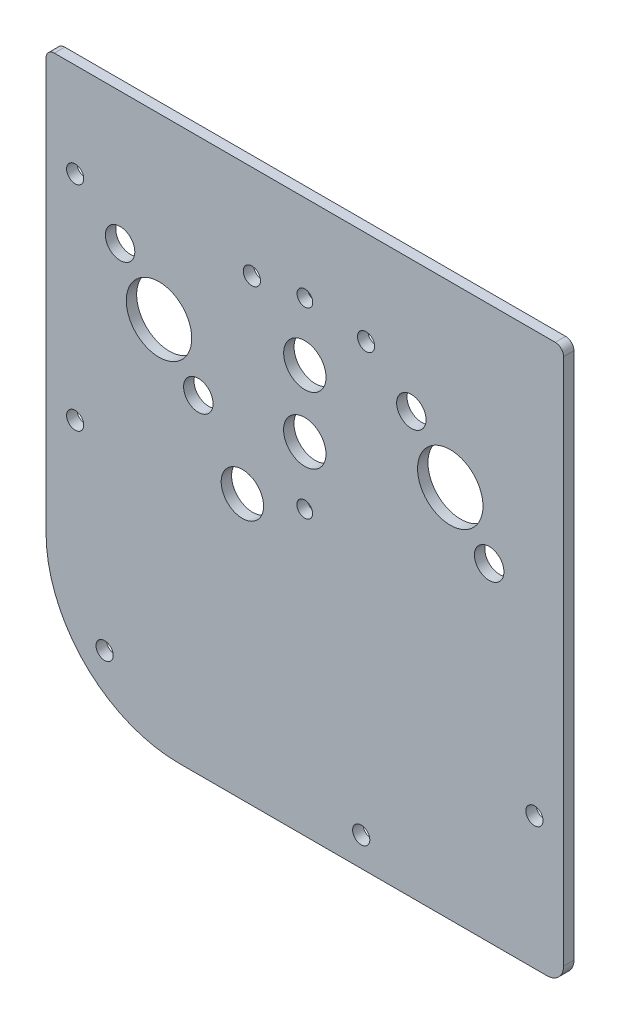
ISO-10303-21;
HEADER;
FILE_DESCRIPTION(('STEP AP214'),'2;1');
FILE_NAME('part.step','',(''),(''),'','','');
FILE_SCHEMA(('AUTOMOTIVE_DESIGN { 1 0 10303 214 1 1 1 1 }'));
ENDSEC;
DATA;
#1=APPLICATION_CONTEXT('core data for automotive mechanical design processes');
#2=APPLICATION_PROTOCOL_DEFINITION('international standard','automotive_design',2000,#1);
#3=PRODUCT_CONTEXT('',#1,'mechanical');
#4=PRODUCT('Part','Part','',(#3));
#5=PRODUCT_RELATED_PRODUCT_CATEGORY('part','',(#4));
#6=PRODUCT_DEFINITION_FORMATION('','',#4);
#7=PRODUCT_DEFINITION_CONTEXT('part definition',#1,'design');
#8=PRODUCT_DEFINITION('design','',#6,#7);
#9=PRODUCT_DEFINITION_SHAPE('','',#8);
#10=(LENGTH_UNIT() NAMED_UNIT(*) SI_UNIT(.MILLI.,.METRE.));
#11=(NAMED_UNIT(*) PLANE_ANGLE_UNIT() SI_UNIT($,.RADIAN.));
#12=(NAMED_UNIT(*) SI_UNIT($,.STERADIAN.) SOLID_ANGLE_UNIT());
#13=UNCERTAINTY_MEASURE_WITH_UNIT(LENGTH_MEASURE(1.E-05),#10,'distance_accuracy_value','');
#14=(GEOMETRIC_REPRESENTATION_CONTEXT(3) GLOBAL_UNCERTAINTY_ASSIGNED_CONTEXT((#13)) GLOBAL_UNIT_ASSIGNED_CONTEXT((#10,
#11,#12)) REPRESENTATION_CONTEXT('',''));
#15=CARTESIAN_POINT('',(0.,0.,0.));
#16=DIRECTION('',(0.,0.,1.));
#17=DIRECTION('',(1.,0.,0.));
#18=AXIS2_PLACEMENT_3D('',#15,#16,#17);
#19=CARTESIAN_POINT('',(17.6273398829879,16.1523200630568,3.175));
#20=DIRECTION('',(0.,0.,-1.));
#21=DIRECTION('',(-1.,0.,0.));
#22=AXIS2_PLACEMENT_3D('',#19,#20,#21);
#23=PLANE('',#22);
#24=DIRECTION('',(-1.,0.,0.));
#25=VECTOR('',#24,1.);
#26=CARTESIAN_POINT('',(-23.0126601170121,144.422318994933,3.175));
#27=LINE('',#26,#25);
#28=CARTESIAN_POINT('',(132.590651825324,144.422318994933,3.175));
#29=VERTEX_POINT('',#28);
#30=CARTESIAN_POINT('',(-20.4726601170121,144.422318994933,3.175));
#31=VERTEX_POINT('',#30);
#32=EDGE_CURVE('E154',#29,#31,#27,.T.);
#33=ORIENTED_EDGE('',*,*,#32,.T.);
#34=CARTESIAN_POINT('',(-20.4726601170121,141.882318994933,3.175));
#35=DIRECTION('',(0.,0.,-1.));
#36=DIRECTION('',(-1.,0.,0.));
#37=AXIS2_PLACEMENT_3D('',#34,#35,#36);
#38=CIRCLE('',#37,2.54);
#39=CARTESIAN_POINT('',(-23.0126601170121,141.882318994933,3.175));
#40=VERTEX_POINT('',#39);
#41=EDGE_CURVE('E139',#31,#40,#38,.F.);
#42=ORIENTED_EDGE('',*,*,#41,.T.);
#43=DIRECTION('',(0.,-1.,0.));
#44=VECTOR('',#43,1.);
#45=CARTESIAN_POINT('',(-23.0126601170121,16.1523200630571,3.175));
#46=LINE('',#45,#44);
#47=CARTESIAN_POINT('',(-23.0126601170121,16.1523200630571,3.175));
#48=VERTEX_POINT('',#47);
#49=EDGE_CURVE('E118',#40,#48,#46,.T.);
#50=ORIENTED_EDGE('',*,*,#49,.T.);
#51=CARTESIAN_POINT('',(17.6273398829879,16.1523200630568,3.175));
#52=DIRECTION('',(0.,0.,1.));
#53=DIRECTION('',(-1.,0.,0.));
#54=AXIS2_PLACEMENT_3D('',#51,#52,#53);
#55=CIRCLE('',#54,40.64);
#56=CARTESIAN_POINT('',(17.6273398829882,-24.4876799369432,3.175));
#57=VERTEX_POINT('',#56);
#58=EDGE_CURVE('E113',#48,#57,#55,.T.);
#59=ORIENTED_EDGE('',*,*,#58,.T.);
#60=DIRECTION('',(1.,0.,0.));
#61=VECTOR('',#60,1.);
#62=CARTESIAN_POINT('',(130.050651825323,-24.4876799369432,3.175));
#63=LINE('',#62,#61);
#64=CARTESIAN_POINT('',(130.050651825323,-24.4876799369432,3.175));
#65=VERTEX_POINT('',#64);
#66=EDGE_CURVE('E102',#57,#65,#63,.T.);
#67=ORIENTED_EDGE('',*,*,#66,.T.);
#68=CARTESIAN_POINT('',(130.050651825323,-19.4076799369432,3.175));
#69=DIRECTION('',(0.,0.,1.));
#70=DIRECTION('',(-1.,0.,0.));
#71=AXIS2_PLACEMENT_3D('',#68,#69,#70);
#72=CIRCLE('',#71,5.08);
#73=CARTESIAN_POINT('',(135.130651825323,-19.4076799369432,3.175));
#74=VERTEX_POINT('',#73);
#75=EDGE_CURVE('E112',#65,#74,#72,.T.);
#76=ORIENTED_EDGE('',*,*,#75,.T.);
#77=DIRECTION('',(0.,1.,0.));
#78=VECTOR('',#77,1.);
#79=CARTESIAN_POINT('',(135.130651825323,119.022318994933,3.175));
#80=LINE('',#79,#78);
#81=CARTESIAN_POINT('',(135.130651825323,141.882318994933,3.175));
#82=VERTEX_POINT('',#81);
#83=EDGE_CURVE('E159',#74,#82,#80,.T.);
#84=ORIENTED_EDGE('',*,*,#83,.T.);
#85=CARTESIAN_POINT('',(132.590651825324,141.882318994933,3.175));
#86=DIRECTION('',(0.,0.,-1.));
#87=DIRECTION('',(-1.,0.,0.));
#88=AXIS2_PLACEMENT_3D('',#85,#86,#87);
#89=CIRCLE('',#88,2.54);
#90=EDGE_CURVE('E137',#82,#29,#89,.F.);
#91=ORIENTED_EDGE('',*,*,#90,.T.);
#92=EDGE_LOOP('',(#33,#42,#50,#59,#67,#76,#84,#91));
#93=FACE_BOUND('',#92,.T.);
#94=CARTESIAN_POINT('',(-14.1226601170121,115.657274827858,3.175));
#95=DIRECTION('',(0.,0.,1.));
#96=DIRECTION('',(1.,0.,0.));
#97=AXIS2_PLACEMENT_3D('',#94,#95,#96);
#98=CIRCLE('',#97,2.625);
#99=CARTESIAN_POINT('',(-11.4976601170121,115.657274827858,3.175));
#100=VERTEX_POINT('',#99);
#101=EDGE_CURVE('E168',#100,#100,#98,.T.);
#102=ORIENTED_EDGE('',*,*,#101,.F.);
#103=EDGE_LOOP('',(#102));
#104=FACE_BOUND('',#103,.T.);
#105=CARTESIAN_POINT('',(56.0501289610006,79.7923335043713,3.175));
#106=DIRECTION('',(0.,0.,1.));
#107=DIRECTION('',(1.,0.,0.));
#108=AXIS2_PLACEMENT_3D('',#105,#106,#107);
#109=CIRCLE('',#108,6.47699999999994);
#110=CARTESIAN_POINT('',(62.5271289610006,79.7923335043713,3.175));
#111=VERTEX_POINT('',#110);
#112=EDGE_CURVE('E187',#111,#111,#109,.T.);
#113=ORIENTED_EDGE('',*,*,#112,.F.);
#114=EDGE_LOOP('',(#113));
#115=FACE_BOUND('',#114,.T.);
#116=CARTESIAN_POINT('',(56.0346118979793,62.0123402754425,3.175));
#117=DIRECTION('',(0.,0.,1.));
#118=DIRECTION('',(1.,0.,0.));
#119=AXIS2_PLACEMENT_3D('',#116,#117,#118);
#120=CIRCLE('',#119,2.40000000000007);
#121=CARTESIAN_POINT('',(58.4346118979794,62.0123402754425,3.175));
#122=VERTEX_POINT('',#121);
#123=EDGE_CURVE('E193',#122,#122,#120,.T.);
#124=ORIENTED_EDGE('',*,*,#123,.F.);
#125=EDGE_LOOP('',(#124));
#126=FACE_BOUND('',#125,.T.);
#127=CARTESIAN_POINT('',(56.0678627473108,100.112325766004,3.175));
#128=DIRECTION('',(0.,0.,1.));
#129=DIRECTION('',(1.,0.,0.));
#130=AXIS2_PLACEMENT_3D('',#127,#128,#129);
#131=CIRCLE('',#130,6.47699999999991);
#132=CARTESIAN_POINT('',(62.5448627473107,100.112325766004,3.175));
#133=VERTEX_POINT('',#132);
#134=EDGE_CURVE('E199',#133,#133,#131,.T.);
#135=ORIENTED_EDGE('',*,*,#134,.F.);
#136=EDGE_LOOP('',(#135));
#137=FACE_BOUND('',#136,.T.);
#138=CARTESIAN_POINT('',(56.0833798103321,117.892318994933,3.175));
#139=DIRECTION('',(0.,0.,1.));
#140=DIRECTION('',(1.,0.,0.));
#141=AXIS2_PLACEMENT_3D('',#138,#139,#140);
#142=CIRCLE('',#141,2.40000000000009);
#143=CARTESIAN_POINT('',(58.4833798103322,117.892318994933,3.175));
#144=VERTEX_POINT('',#143);
#145=EDGE_CURVE('E205',#144,#144,#142,.T.);
#146=ORIENTED_EDGE('',*,*,#145,.F.);
#147=EDGE_LOOP('',(#146));
#148=FACE_BOUND('',#147,.T.);
#149=CARTESIAN_POINT('',(36.9797887004855,56.4940646999634,3.175));
#150=DIRECTION('',(0.,0.,1.));
#151=DIRECTION('',(1.,0.,0.));
#152=AXIS2_PLACEMENT_3D('',#149,#150,#151);
#153=CIRCLE('',#152,6.47699999999992);
#154=CARTESIAN_POINT('',(43.4567887004854,56.4940646999634,3.175));
#155=VERTEX_POINT('',#154);
#156=EDGE_CURVE('E211',#155,#155,#153,.T.);
#157=ORIENTED_EDGE('',*,*,#156,.F.);
#158=EDGE_LOOP('',(#157));
#159=FACE_BOUND('',#158,.T.);
#160=CARTESIAN_POINT('',(39.8805714177449,115.657274827858,3.175));
#161=DIRECTION('',(0.,0.,1.));
#162=DIRECTION('',(1.,0.,0.));
#163=AXIS2_PLACEMENT_3D('',#160,#161,#162);
#164=CIRCLE('',#163,2.625);
#165=CARTESIAN_POINT('',(42.5055714177449,115.657274827858,3.175));
#166=VERTEX_POINT('',#165);
#167=EDGE_CURVE('E217',#166,#166,#164,.T.);
#168=ORIENTED_EDGE('',*,*,#167,.F.);
#169=EDGE_LOOP('',(#168));
#170=FACE_BOUND('',#169,.T.);
#171=CARTESIAN_POINT('',(74.7774202905663,115.710615977275,3.175));
#172=DIRECTION('',(0.,0.,1.));
#173=DIRECTION('',(1.,0.,0.));
#174=AXIS2_PLACEMENT_3D('',#171,#172,#173);
#175=CIRCLE('',#174,2.625);
#176=CARTESIAN_POINT('',(77.4024202905663,115.710615977275,3.175));
#177=VERTEX_POINT('',#176);
#178=EDGE_CURVE('E223',#177,#177,#175,.T.);
#179=ORIENTED_EDGE('',*,*,#178,.F.);
#180=EDGE_LOOP('',(#179));
#181=FACE_BOUND('',#180,.T.);
#182=CARTESIAN_POINT('',(-14.1226601170121,50.442319528995,3.175));
#183=DIRECTION('',(0.,0.,1.));
#184=DIRECTION('',(1.,0.,0.));
#185=AXIS2_PLACEMENT_3D('',#182,#183,#184);
#186=CIRCLE('',#185,2.625);
#187=CARTESIAN_POINT('',(-11.4976601170121,50.442319528995,3.175));
#188=VERTEX_POINT('',#187);
#189=EDGE_CURVE('E229',#188,#188,#186,.T.);
#190=ORIENTED_EDGE('',*,*,#189,.F.);
#191=EDGE_LOOP('',(#190));
#192=FACE_BOUND('',#191,.T.);
#193=CARTESIAN_POINT('',(88.617464571678,104.150823250246,3.175));
#194=DIRECTION('',(0.,0.,1.));
#195=DIRECTION('',(1.,0.,0.));
#196=AXIS2_PLACEMENT_3D('',#193,#194,#195);
#197=CIRCLE('',#196,4.50000370000001);
#198=CARTESIAN_POINT('',(93.117468271678,104.150823250246,3.175));
#199=VERTEX_POINT('',#198);
#200=EDGE_CURVE('E235',#199,#199,#197,.T.);
#201=ORIENTED_EDGE('',*,*,#200,.F.);
#202=EDGE_LOOP('',(#201));
#203=FACE_BOUND('',#202,.T.);
#204=CARTESIAN_POINT('',(-5.12428887698043,-6.01627799885446,3.175));
#205=DIRECTION('',(0.,0.,1.));
#206=DIRECTION('',(1.,0.,0.));
#207=AXIS2_PLACEMENT_3D('',#204,#205,#206);
#208=CIRCLE('',#207,2.625);
#209=CARTESIAN_POINT('',(-2.49928887698043,-6.01627799885446,3.175));
#210=VERTEX_POINT('',#209);
#211=EDGE_CURVE('E241',#210,#210,#208,.T.);
#212=ORIENTED_EDGE('',*,*,#211,.F.);
#213=EDGE_LOOP('',(#212));
#214=FACE_BOUND('',#213,.T.);
#215=CARTESIAN_POINT('',(112.400607544212,75.807177169546,3.175));
#216=DIRECTION('',(0.,0.,1.));
#217=DIRECTION('',(1.,0.,0.));
#218=AXIS2_PLACEMENT_3D('',#215,#216,#217);
#219=CIRCLE('',#218,4.50000370000001);
#220=CARTESIAN_POINT('',(116.900611244212,75.807177169546,3.175));
#221=VERTEX_POINT('',#220);
#222=EDGE_CURVE('E247',#221,#221,#219,.T.);
#223=ORIENTED_EDGE('',*,*,#222,.F.);
#224=EDGE_LOOP('',(#223));
#225=FACE_BOUND('',#224,.T.);
#226=CARTESIAN_POINT('',(73.2964118888717,-15.5976799369432,3.175));
#227=DIRECTION('',(0.,0.,1.));
#228=DIRECTION('',(1.,0.,0.));
#229=AXIS2_PLACEMENT_3D('',#226,#227,#228);
#230=CIRCLE('',#229,2.625);
#231=CARTESIAN_POINT('',(75.9214118888717,-15.5976799369432,3.175));
#232=VERTEX_POINT('',#231);
#233=EDGE_CURVE('E253',#232,#232,#230,.T.);
#234=ORIENTED_EDGE('',*,*,#233,.F.);
#235=EDGE_LOOP('',(#234));
#236=FACE_BOUND('',#235,.T.);
#237=CARTESIAN_POINT('',(126.240651825324,15.9467567381489,3.175));
#238=DIRECTION('',(0.,0.,1.));
#239=DIRECTION('',(1.,0.,0.));
#240=AXIS2_PLACEMENT_3D('',#237,#238,#239);
#241=CIRCLE('',#240,2.625);
#242=CARTESIAN_POINT('',(128.865651825324,15.9467567381489,3.175));
#243=VERTEX_POINT('',#242);
#244=EDGE_CURVE('E259',#243,#243,#241,.T.);
#245=ORIENTED_EDGE('',*,*,#244,.F.);
#246=EDGE_LOOP('',(#245));
#247=FACE_BOUND('',#246,.T.);
#248=CARTESIAN_POINT('',(-0.390448586593796,104.097482100829,3.175));
#249=DIRECTION('',(0.,0.,1.));
#250=DIRECTION('',(1.,0.,0.));
#251=AXIS2_PLACEMENT_3D('',#248,#249,#250);
#252=CIRCLE('',#251,4.5000037);
#253=CARTESIAN_POINT('',(4.10955511340621,104.097482100829,3.175));
#254=VERTEX_POINT('',#253);
#255=EDGE_CURVE('E265',#254,#254,#252,.T.);
#256=ORIENTED_EDGE('',*,*,#255,.F.);
#257=EDGE_LOOP('',(#256));
#258=FACE_BOUND('',#257,.T.);
#259=CARTESIAN_POINT('',(23.5185431332483,75.8599135486231,3.175));
#260=DIRECTION('',(0.,0.,1.));
#261=DIRECTION('',(1.,0.,0.));
#262=AXIS2_PLACEMENT_3D('',#259,#260,#261);
#263=CIRCLE('',#262,4.5000037);
#264=CARTESIAN_POINT('',(28.0185468332483,75.8599135486231,3.175));
#265=VERTEX_POINT('',#264);
#266=EDGE_CURVE('E271',#265,#265,#263,.T.);
#267=ORIENTED_EDGE('',*,*,#266,.F.);
#268=EDGE_LOOP('',(#267));
#269=FACE_BOUND('',#268,.T.);
#270=CARTESIAN_POINT('',(11.5011228996736,89.925659060479,3.175));
#271=DIRECTION('',(0.,0.,1.));
#272=DIRECTION('',(1.,0.,0.));
#273=AXIS2_PLACEMENT_3D('',#270,#271,#272);
#274=CIRCLE('',#273,10.0000000000002);
#275=CARTESIAN_POINT('',(21.5011228996738,89.925659060479,3.175));
#276=VERTEX_POINT('',#275);
#277=EDGE_CURVE('E277',#276,#276,#274,.T.);
#278=ORIENTED_EDGE('',*,*,#277,.F.);
#279=EDGE_LOOP('',(#278));
#280=FACE_BOUND('',#279,.T.);
#281=CARTESIAN_POINT('',(100.509036057945,89.9790002098961,3.175));
#282=DIRECTION('',(0.,0.,1.));
#283=DIRECTION('',(1.,0.,0.));
#284=AXIS2_PLACEMENT_3D('',#281,#282,#283);
#285=CIRCLE('',#284,10.0000000000002);
#286=CARTESIAN_POINT('',(110.509036057945,89.9790002098961,3.175));
#287=VERTEX_POINT('',#286);
#288=EDGE_CURVE('E283',#287,#287,#285,.T.);
#289=ORIENTED_EDGE('',*,*,#288,.F.);
#290=EDGE_LOOP('',(#289));
#291=FACE_BOUND('',#290,.T.);
#292=ADVANCED_FACE('F34',(#93,#104,#115,#126,#137,#148,#159,#170,#181,#192,#203,#214,#225,#236,
#247,#258,#269,#280,#291),#23,.F.);
#293=CARTESIAN_POINT('',(17.6273398829879,16.1523200630568,0.));
#294=DIRECTION('',(0.,0.,-1.));
#295=DIRECTION('',(-1.,0.,0.));
#296=AXIS2_PLACEMENT_3D('',#293,#294,#295);
#297=PLANE('',#296);
#298=CARTESIAN_POINT('',(11.5011228996736,89.925659060479,0.));
#299=DIRECTION('',(0.,0.,1.));
#300=DIRECTION('',(1.,0.,0.));
#301=AXIS2_PLACEMENT_3D('',#298,#299,#300);
#302=CIRCLE('',#301,10.0000000000002);
#303=CARTESIAN_POINT('',(21.5011228996738,89.925659060479,0.));
#304=VERTEX_POINT('',#303);
#305=EDGE_CURVE('E280',#304,#304,#302,.T.);
#306=ORIENTED_EDGE('',*,*,#305,.T.);
#307=EDGE_LOOP('',(#306));
#308=FACE_BOUND('',#307,.T.);
#309=CARTESIAN_POINT('',(-0.390448586593796,104.097482100829,0.));
#310=DIRECTION('',(0.,0.,1.));
#311=DIRECTION('',(1.,0.,0.));
#312=AXIS2_PLACEMENT_3D('',#309,#310,#311);
#313=CIRCLE('',#312,4.5000037);
#314=CARTESIAN_POINT('',(4.10955511340621,104.097482100829,0.));
#315=VERTEX_POINT('',#314);
#316=EDGE_CURVE('E268',#315,#315,#313,.T.);
#317=ORIENTED_EDGE('',*,*,#316,.T.);
#318=EDGE_LOOP('',(#317));
#319=FACE_BOUND('',#318,.T.);
#320=CARTESIAN_POINT('',(73.2964118888717,-15.5976799369432,0.));
#321=DIRECTION('',(0.,0.,1.));
#322=DIRECTION('',(1.,0.,0.));
#323=AXIS2_PLACEMENT_3D('',#320,#321,#322);
#324=CIRCLE('',#323,2.625);
#325=CARTESIAN_POINT('',(75.9214118888717,-15.5976799369432,0.));
#326=VERTEX_POINT('',#325);
#327=EDGE_CURVE('E256',#326,#326,#324,.T.);
#328=ORIENTED_EDGE('',*,*,#327,.T.);
#329=EDGE_LOOP('',(#328));
#330=FACE_BOUND('',#329,.T.);
#331=CARTESIAN_POINT('',(-5.12428887698043,-6.01627799885446,0.));
#332=DIRECTION('',(0.,0.,1.));
#333=DIRECTION('',(1.,0.,0.));
#334=AXIS2_PLACEMENT_3D('',#331,#332,#333);
#335=CIRCLE('',#334,2.625);
#336=CARTESIAN_POINT('',(-2.49928887698043,-6.01627799885446,0.));
#337=VERTEX_POINT('',#336);
#338=EDGE_CURVE('E244',#337,#337,#335,.T.);
#339=ORIENTED_EDGE('',*,*,#338,.T.);
#340=EDGE_LOOP('',(#339));
#341=FACE_BOUND('',#340,.T.);
#342=CARTESIAN_POINT('',(-14.1226601170121,50.442319528995,0.));
#343=DIRECTION('',(0.,0.,1.));
#344=DIRECTION('',(1.,0.,0.));
#345=AXIS2_PLACEMENT_3D('',#342,#343,#344);
#346=CIRCLE('',#345,2.625);
#347=CARTESIAN_POINT('',(-11.4976601170121,50.442319528995,0.));
#348=VERTEX_POINT('',#347);
#349=EDGE_CURVE('E232',#348,#348,#346,.T.);
#350=ORIENTED_EDGE('',*,*,#349,.T.);
#351=EDGE_LOOP('',(#350));
#352=FACE_BOUND('',#351,.T.);
#353=CARTESIAN_POINT('',(39.8805714177449,115.657274827858,0.));
#354=DIRECTION('',(0.,0.,1.));
#355=DIRECTION('',(1.,0.,0.));
#356=AXIS2_PLACEMENT_3D('',#353,#354,#355);
#357=CIRCLE('',#356,2.625);
#358=CARTESIAN_POINT('',(42.5055714177449,115.657274827858,0.));
#359=VERTEX_POINT('',#358);
#360=EDGE_CURVE('E220',#359,#359,#357,.T.);
#361=ORIENTED_EDGE('',*,*,#360,.T.);
#362=EDGE_LOOP('',(#361));
#363=FACE_BOUND('',#362,.T.);
#364=CARTESIAN_POINT('',(56.0833798103321,117.892318994933,0.));
#365=DIRECTION('',(0.,0.,1.));
#366=DIRECTION('',(1.,0.,0.));
#367=AXIS2_PLACEMENT_3D('',#364,#365,#366);
#368=CIRCLE('',#367,2.40000000000009);
#369=CARTESIAN_POINT('',(58.4833798103322,117.892318994933,0.));
#370=VERTEX_POINT('',#369);
#371=EDGE_CURVE('E208',#370,#370,#368,.T.);
#372=ORIENTED_EDGE('',*,*,#371,.T.);
#373=EDGE_LOOP('',(#372));
#374=FACE_BOUND('',#373,.T.);
#375=CARTESIAN_POINT('',(56.0346118979793,62.0123402754425,0.));
#376=DIRECTION('',(0.,0.,1.));
#377=DIRECTION('',(1.,0.,0.));
#378=AXIS2_PLACEMENT_3D('',#375,#376,#377);
#379=CIRCLE('',#378,2.40000000000007);
#380=CARTESIAN_POINT('',(58.4346118979794,62.0123402754425,0.));
#381=VERTEX_POINT('',#380);
#382=EDGE_CURVE('E196',#381,#381,#379,.T.);
#383=ORIENTED_EDGE('',*,*,#382,.T.);
#384=EDGE_LOOP('',(#383));
#385=FACE_BOUND('',#384,.T.);
#386=CARTESIAN_POINT('',(-14.1226601170121,115.657274827858,0.));
#387=DIRECTION('',(0.,0.,1.));
#388=DIRECTION('',(1.,0.,0.));
#389=AXIS2_PLACEMENT_3D('',#386,#387,#388);
#390=CIRCLE('',#389,2.625);
#391=CARTESIAN_POINT('',(-11.4976601170121,115.657274827858,0.));
#392=VERTEX_POINT('',#391);
#393=EDGE_CURVE('E184',#392,#392,#390,.T.);
#394=ORIENTED_EDGE('',*,*,#393,.T.);
#395=EDGE_LOOP('',(#394));
#396=FACE_BOUND('',#395,.T.);
#397=DIRECTION('',(0.,-1.,0.));
#398=VECTOR('',#397,1.);
#399=CARTESIAN_POINT('',(-23.0126601170121,16.1523200630571,0.));
#400=LINE('',#399,#398);
#401=CARTESIAN_POINT('',(-23.0126601170121,141.882318994933,0.));
#402=VERTEX_POINT('',#401);
#403=CARTESIAN_POINT('',(-23.0126601170121,16.1523200630571,0.));
#404=VERTEX_POINT('',#403);
#405=EDGE_CURVE('E122',#402,#404,#400,.T.);
#406=ORIENTED_EDGE('',*,*,#405,.F.);
#407=CARTESIAN_POINT('',(-20.4726601170121,141.882318994933,0.));
#408=DIRECTION('',(0.,0.,-1.));
#409=DIRECTION('',(-1.,0.,0.));
#410=AXIS2_PLACEMENT_3D('',#407,#408,#409);
#411=CIRCLE('',#410,2.54);
#412=CARTESIAN_POINT('',(-20.4726601170121,144.422318994933,0.));
#413=VERTEX_POINT('',#412);
#414=EDGE_CURVE('E42',#402,#413,#411,.T.);
#415=ORIENTED_EDGE('',*,*,#414,.T.);
#416=DIRECTION('',(-1.,0.,0.));
#417=VECTOR('',#416,1.);
#418=CARTESIAN_POINT('',(-23.0126601170121,144.422318994933,0.));
#419=LINE('',#418,#417);
#420=CARTESIAN_POINT('',(132.590651825324,144.422318994933,0.));
#421=VERTEX_POINT('',#420);
#422=EDGE_CURVE('E146',#421,#413,#419,.T.);
#423=ORIENTED_EDGE('',*,*,#422,.F.);
#424=CARTESIAN_POINT('',(132.590651825324,141.882318994933,0.));
#425=DIRECTION('',(0.,0.,-1.));
#426=DIRECTION('',(-1.,0.,0.));
#427=AXIS2_PLACEMENT_3D('',#424,#425,#426);
#428=CIRCLE('',#427,2.54);
#429=CARTESIAN_POINT('',(135.130651825323,141.882318994933,0.));
#430=VERTEX_POINT('',#429);
#431=EDGE_CURVE('E49',#421,#430,#428,.T.);
#432=ORIENTED_EDGE('',*,*,#431,.T.);
#433=DIRECTION('',(0.,1.,0.));
#434=VECTOR('',#433,1.);
#435=CARTESIAN_POINT('',(135.130651825323,119.022318994933,0.));
#436=LINE('',#435,#434);
#437=CARTESIAN_POINT('',(135.130651825323,-19.4076799369432,0.));
#438=VERTEX_POINT('',#437);
#439=EDGE_CURVE('E172',#438,#430,#436,.T.);
#440=ORIENTED_EDGE('',*,*,#439,.F.);
#441=CARTESIAN_POINT('',(130.050651825323,-19.4076799369432,0.));
#442=DIRECTION('',(0.,0.,1.));
#443=DIRECTION('',(-1.,0.,0.));
#444=AXIS2_PLACEMENT_3D('',#441,#442,#443);
#445=CIRCLE('',#444,5.08);
#446=CARTESIAN_POINT('',(130.050651825323,-24.4876799369432,0.));
#447=VERTEX_POINT('',#446);
#448=EDGE_CURVE('E170',#447,#438,#445,.T.);
#449=ORIENTED_EDGE('',*,*,#448,.F.);
#450=DIRECTION('',(1.,0.,0.));
#451=VECTOR('',#450,1.);
#452=CARTESIAN_POINT('',(130.050651825323,-24.4876799369432,0.));
#453=LINE('',#452,#451);
#454=CARTESIAN_POINT('',(17.6273398829882,-24.4876799369432,0.));
#455=VERTEX_POINT('',#454);
#456=EDGE_CURVE('E167',#455,#447,#453,.T.);
#457=ORIENTED_EDGE('',*,*,#456,.F.);
#458=CARTESIAN_POINT('',(17.6273398829879,16.1523200630568,0.));
#459=DIRECTION('',(0.,0.,1.));
#460=DIRECTION('',(-1.,0.,0.));
#461=AXIS2_PLACEMENT_3D('',#458,#459,#460);
#462=CIRCLE('',#461,40.64);
#463=EDGE_CURVE('E126',#404,#455,#462,.T.);
#464=ORIENTED_EDGE('',*,*,#463,.F.);
#465=EDGE_LOOP('',(#406,#415,#423,#432,#440,#449,#457,#464));
#466=FACE_BOUND('',#465,.T.);
#467=CARTESIAN_POINT('',(56.0501289610006,79.7923335043713,0.));
#468=DIRECTION('',(0.,0.,1.));
#469=DIRECTION('',(1.,0.,0.));
#470=AXIS2_PLACEMENT_3D('',#467,#468,#469);
#471=CIRCLE('',#470,6.47699999999994);
#472=CARTESIAN_POINT('',(62.5271289610006,79.7923335043713,0.));
#473=VERTEX_POINT('',#472);
#474=EDGE_CURVE('E190',#473,#473,#471,.T.);
#475=ORIENTED_EDGE('',*,*,#474,.T.);
#476=EDGE_LOOP('',(#475));
#477=FACE_BOUND('',#476,.T.);
#478=CARTESIAN_POINT('',(56.0678627473108,100.112325766004,0.));
#479=DIRECTION('',(0.,0.,1.));
#480=DIRECTION('',(1.,0.,0.));
#481=AXIS2_PLACEMENT_3D('',#478,#479,#480);
#482=CIRCLE('',#481,6.47699999999991);
#483=CARTESIAN_POINT('',(62.5448627473107,100.112325766004,0.));
#484=VERTEX_POINT('',#483);
#485=EDGE_CURVE('E202',#484,#484,#482,.T.);
#486=ORIENTED_EDGE('',*,*,#485,.T.);
#487=EDGE_LOOP('',(#486));
#488=FACE_BOUND('',#487,.T.);
#489=CARTESIAN_POINT('',(36.9797887004855,56.4940646999634,0.));
#490=DIRECTION('',(0.,0.,1.));
#491=DIRECTION('',(1.,0.,0.));
#492=AXIS2_PLACEMENT_3D('',#489,#490,#491);
#493=CIRCLE('',#492,6.47699999999992);
#494=CARTESIAN_POINT('',(43.4567887004854,56.4940646999634,0.));
#495=VERTEX_POINT('',#494);
#496=EDGE_CURVE('E214',#495,#495,#493,.T.);
#497=ORIENTED_EDGE('',*,*,#496,.T.);
#498=EDGE_LOOP('',(#497));
#499=FACE_BOUND('',#498,.T.);
#500=CARTESIAN_POINT('',(74.7774202905663,115.710615977275,0.));
#501=DIRECTION('',(0.,0.,1.));
#502=DIRECTION('',(1.,0.,0.));
#503=AXIS2_PLACEMENT_3D('',#500,#501,#502);
#504=CIRCLE('',#503,2.625);
#505=CARTESIAN_POINT('',(77.4024202905663,115.710615977275,0.));
#506=VERTEX_POINT('',#505);
#507=EDGE_CURVE('E226',#506,#506,#504,.T.);
#508=ORIENTED_EDGE('',*,*,#507,.T.);
#509=EDGE_LOOP('',(#508));
#510=FACE_BOUND('',#509,.T.);
#511=CARTESIAN_POINT('',(88.617464571678,104.150823250246,0.));
#512=DIRECTION('',(0.,0.,1.));
#513=DIRECTION('',(1.,0.,0.));
#514=AXIS2_PLACEMENT_3D('',#511,#512,#513);
#515=CIRCLE('',#514,4.50000370000001);
#516=CARTESIAN_POINT('',(93.117468271678,104.150823250246,0.));
#517=VERTEX_POINT('',#516);
#518=EDGE_CURVE('E238',#517,#517,#515,.T.);
#519=ORIENTED_EDGE('',*,*,#518,.T.);
#520=EDGE_LOOP('',(#519));
#521=FACE_BOUND('',#520,.T.);
#522=CARTESIAN_POINT('',(112.400607544212,75.807177169546,0.));
#523=DIRECTION('',(0.,0.,1.));
#524=DIRECTION('',(1.,0.,0.));
#525=AXIS2_PLACEMENT_3D('',#522,#523,#524);
#526=CIRCLE('',#525,4.50000370000001);
#527=CARTESIAN_POINT('',(116.900611244212,75.807177169546,0.));
#528=VERTEX_POINT('',#527);
#529=EDGE_CURVE('E250',#528,#528,#526,.T.);
#530=ORIENTED_EDGE('',*,*,#529,.T.);
#531=EDGE_LOOP('',(#530));
#532=FACE_BOUND('',#531,.T.);
#533=CARTESIAN_POINT('',(126.240651825324,15.9467567381489,0.));
#534=DIRECTION('',(0.,0.,1.));
#535=DIRECTION('',(1.,0.,0.));
#536=AXIS2_PLACEMENT_3D('',#533,#534,#535);
#537=CIRCLE('',#536,2.625);
#538=CARTESIAN_POINT('',(128.865651825324,15.9467567381489,0.));
#539=VERTEX_POINT('',#538);
#540=EDGE_CURVE('E262',#539,#539,#537,.T.);
#541=ORIENTED_EDGE('',*,*,#540,.T.);
#542=EDGE_LOOP('',(#541));
#543=FACE_BOUND('',#542,.T.);
#544=CARTESIAN_POINT('',(23.5185431332483,75.8599135486231,0.));
#545=DIRECTION('',(0.,0.,1.));
#546=DIRECTION('',(1.,0.,0.));
#547=AXIS2_PLACEMENT_3D('',#544,#545,#546);
#548=CIRCLE('',#547,4.5000037);
#549=CARTESIAN_POINT('',(28.0185468332483,75.8599135486231,0.));
#550=VERTEX_POINT('',#549);
#551=EDGE_CURVE('E274',#550,#550,#548,.T.);
#552=ORIENTED_EDGE('',*,*,#551,.T.);
#553=EDGE_LOOP('',(#552));
#554=FACE_BOUND('',#553,.T.);
#555=CARTESIAN_POINT('',(100.509036057945,89.9790002098961,0.));
#556=DIRECTION('',(0.,0.,1.));
#557=DIRECTION('',(1.,0.,0.));
#558=AXIS2_PLACEMENT_3D('',#555,#556,#557);
#559=CIRCLE('',#558,10.0000000000002);
#560=CARTESIAN_POINT('',(110.509036057945,89.9790002098961,0.));
#561=VERTEX_POINT('',#560);
#562=EDGE_CURVE('E153',#561,#561,#559,.T.);
#563=ORIENTED_EDGE('',*,*,#562,.T.);
#564=EDGE_LOOP('',(#563));
#565=FACE_BOUND('',#564,.T.);
#566=ADVANCED_FACE('F144',(#308,#319,#330,#341,#352,#363,#374,#385,#396,#466,#477,#488,#499,
#510,#521,#532,#543,#554,#565),#297,.T.);
#567=CARTESIAN_POINT('',(17.6273398829879,16.1523200630568,3.175));
#568=DIRECTION('',(0.,0.,-1.));
#569=DIRECTION('',(-1.,0.,0.));
#570=AXIS2_PLACEMENT_3D('',#567,#568,#569);
#571=CYLINDRICAL_SURFACE('',#570,40.64);
#572=ORIENTED_EDGE('',*,*,#463,.T.);
#573=DIRECTION('',(0.,0.,-1.));
#574=VECTOR('',#573,1.);
#575=CARTESIAN_POINT('',(17.6273398829882,-24.4876799369432,3.175));
#576=LINE('',#575,#574);
#577=EDGE_CURVE('E106',#57,#455,#576,.T.);
#578=ORIENTED_EDGE('',*,*,#577,.F.);
#579=ORIENTED_EDGE('',*,*,#58,.F.);
#580=DIRECTION('',(0.,0.,-1.));
#581=VECTOR('',#580,1.);
#582=CARTESIAN_POINT('',(-23.0126601170121,16.1523200630571,3.175));
#583=LINE('',#582,#581);
#584=EDGE_CURVE('E158',#48,#404,#583,.T.);
#585=ORIENTED_EDGE('',*,*,#584,.T.);
#586=EDGE_LOOP('',(#572,#578,#579,#585));
#587=FACE_BOUND('',#586,.T.);
#588=ADVANCED_FACE('F124',(#587),#571,.T.);
#589=CARTESIAN_POINT('',(130.050651825323,-24.4876799369432,3.175));
#590=DIRECTION('',(0.,1.,0.));
#591=DIRECTION('',(0.,0.,1.));
#592=AXIS2_PLACEMENT_3D('',#589,#590,#591);
#593=PLANE('',#592);
#594=ORIENTED_EDGE('',*,*,#456,.T.);
#595=DIRECTION('',(0.,0.,-1.));
#596=VECTOR('',#595,1.);
#597=CARTESIAN_POINT('',(130.050651825323,-24.4876799369432,3.175));
#598=LINE('',#597,#596);
#599=EDGE_CURVE('E109',#65,#447,#598,.T.);
#600=ORIENTED_EDGE('',*,*,#599,.F.);
#601=ORIENTED_EDGE('',*,*,#66,.F.);
#602=ORIENTED_EDGE('',*,*,#577,.T.);
#603=EDGE_LOOP('',(#594,#600,#601,#602));
#604=FACE_BOUND('',#603,.T.);
#605=ADVANCED_FACE('F104',(#604),#593,.F.);
#606=CARTESIAN_POINT('',(130.050651825323,-19.4076799369432,3.175));
#607=DIRECTION('',(0.,0.,-1.));
#608=DIRECTION('',(-1.,0.,0.));
#609=AXIS2_PLACEMENT_3D('',#606,#607,#608);
#610=CYLINDRICAL_SURFACE('',#609,5.08);
#611=ORIENTED_EDGE('',*,*,#448,.T.);
#612=DIRECTION('',(0.,0.,-1.));
#613=VECTOR('',#612,1.);
#614=CARTESIAN_POINT('',(135.130651825323,-19.4076799369432,3.175));
#615=LINE('',#614,#613);
#616=EDGE_CURVE('E131',#74,#438,#615,.T.);
#617=ORIENTED_EDGE('',*,*,#616,.F.);
#618=ORIENTED_EDGE('',*,*,#75,.F.);
#619=ORIENTED_EDGE('',*,*,#599,.T.);
#620=EDGE_LOOP('',(#611,#617,#618,#619));
#621=FACE_BOUND('',#620,.T.);
#622=ADVANCED_FACE('F182',(#621),#610,.T.);
#623=CARTESIAN_POINT('',(135.130651825323,119.022318994933,3.175));
#624=DIRECTION('',(-1.,0.,0.));
#625=DIRECTION('',(0.,0.,1.));
#626=AXIS2_PLACEMENT_3D('',#623,#624,#625);
#627=PLANE('',#626);
#628=ORIENTED_EDGE('',*,*,#439,.T.);
#629=DIRECTION('',(0.,0.,1.));
#630=VECTOR('',#629,1.);
#631=CARTESIAN_POINT('',(135.130651825323,141.882318994933,3.175));
#632=LINE('',#631,#630);
#633=EDGE_CURVE('E11',#430,#82,#632,.T.);
#634=ORIENTED_EDGE('',*,*,#633,.T.);
#635=ORIENTED_EDGE('',*,*,#83,.F.);
#636=ORIENTED_EDGE('',*,*,#616,.T.);
#637=EDGE_LOOP('',(#628,#634,#635,#636));
#638=FACE_BOUND('',#637,.T.);
#639=ADVANCED_FACE('F178',(#638),#627,.F.);
#640=CARTESIAN_POINT('',(-23.0126601170121,16.1523200630571,3.175));
#641=DIRECTION('',(1.,0.,0.));
#642=DIRECTION('',(0.,0.,-1.));
#643=AXIS2_PLACEMENT_3D('',#640,#641,#642);
#644=PLANE('',#643);
#645=ORIENTED_EDGE('',*,*,#49,.F.);
#646=DIRECTION('',(0.,0.,1.));
#647=VECTOR('',#646,1.);
#648=CARTESIAN_POINT('',(-23.0126601170121,141.882318994933,0.));
#649=LINE('',#648,#647);
#650=EDGE_CURVE('E57',#40,#402,#649,.F.);
#651=ORIENTED_EDGE('',*,*,#650,.T.);
#652=ORIENTED_EDGE('',*,*,#405,.T.);
#653=ORIENTED_EDGE('',*,*,#584,.F.);
#654=EDGE_LOOP('',(#645,#651,#652,#653));
#655=FACE_BOUND('',#654,.T.);
#656=ADVANCED_FACE('F157',(#655),#644,.F.);
#657=CARTESIAN_POINT('',(-14.1226601170121,115.657274827858,3.175));
#658=DIRECTION('',(0.,0.,-1.));
#659=DIRECTION('',(-1.,0.,0.));
#660=AXIS2_PLACEMENT_3D('',#657,#658,#659);
#661=CYLINDRICAL_SURFACE('',#660,2.625);
#662=ORIENTED_EDGE('',*,*,#101,.T.);
#663=EDGE_LOOP('',(#662));
#664=FACE_BOUND('',#663,.T.);
#665=ORIENTED_EDGE('',*,*,#393,.F.);
#666=EDGE_LOOP('',(#665));
#667=FACE_BOUND('',#666,.T.);
#668=ADVANCED_FACE('F303',(#664,#667),#661,.F.);
#669=CARTESIAN_POINT('',(56.0501289610006,79.7923335043713,3.175));
#670=DIRECTION('',(0.,0.,-1.));
#671=DIRECTION('',(-1.,0.,0.));
#672=AXIS2_PLACEMENT_3D('',#669,#670,#671);
#673=CYLINDRICAL_SURFACE('',#672,6.47699999999994);
#674=ORIENTED_EDGE('',*,*,#112,.T.);
#675=EDGE_LOOP('',(#674));
#676=FACE_BOUND('',#675,.T.);
#677=ORIENTED_EDGE('',*,*,#474,.F.);
#678=EDGE_LOOP('',(#677));
#679=FACE_BOUND('',#678,.T.);
#680=ADVANCED_FACE('F385',(#676,#679),#673,.F.);
#681=CARTESIAN_POINT('',(56.0346118979793,62.0123402754425,3.175));
#682=DIRECTION('',(0.,0.,-1.));
#683=DIRECTION('',(-1.,0.,0.));
#684=AXIS2_PLACEMENT_3D('',#681,#682,#683);
#685=CYLINDRICAL_SURFACE('',#684,2.40000000000007);
#686=ORIENTED_EDGE('',*,*,#123,.T.);
#687=EDGE_LOOP('',(#686));
#688=FACE_BOUND('',#687,.T.);
#689=ORIENTED_EDGE('',*,*,#382,.F.);
#690=EDGE_LOOP('',(#689));
#691=FACE_BOUND('',#690,.T.);
#692=ADVANCED_FACE('F382',(#688,#691),#685,.F.);
#693=CARTESIAN_POINT('',(56.0678627473108,100.112325766004,3.175));
#694=DIRECTION('',(0.,0.,-1.));
#695=DIRECTION('',(-1.,0.,0.));
#696=AXIS2_PLACEMENT_3D('',#693,#694,#695);
#697=CYLINDRICAL_SURFACE('',#696,6.47699999999991);
#698=ORIENTED_EDGE('',*,*,#134,.T.);
#699=EDGE_LOOP('',(#698));
#700=FACE_BOUND('',#699,.T.);
#701=ORIENTED_EDGE('',*,*,#485,.F.);
#702=EDGE_LOOP('',(#701));
#703=FACE_BOUND('',#702,.T.);
#704=ADVANCED_FACE('F378',(#700,#703),#697,.F.);
#705=CARTESIAN_POINT('',(56.0833798103321,117.892318994933,3.175));
#706=DIRECTION('',(0.,0.,-1.));
#707=DIRECTION('',(-1.,0.,0.));
#708=AXIS2_PLACEMENT_3D('',#705,#706,#707);
#709=CYLINDRICAL_SURFACE('',#708,2.40000000000009);
#710=ORIENTED_EDGE('',*,*,#145,.T.);
#711=EDGE_LOOP('',(#710));
#712=FACE_BOUND('',#711,.T.);
#713=ORIENTED_EDGE('',*,*,#371,.F.);
#714=EDGE_LOOP('',(#713));
#715=FACE_BOUND('',#714,.T.);
#716=ADVANCED_FACE('F374',(#712,#715),#709,.F.);
#717=CARTESIAN_POINT('',(36.9797887004855,56.4940646999634,3.175));
#718=DIRECTION('',(0.,0.,-1.));
#719=DIRECTION('',(-1.,0.,0.));
#720=AXIS2_PLACEMENT_3D('',#717,#718,#719);
#721=CYLINDRICAL_SURFACE('',#720,6.47699999999992);
#722=ORIENTED_EDGE('',*,*,#156,.T.);
#723=EDGE_LOOP('',(#722));
#724=FACE_BOUND('',#723,.T.);
#725=ORIENTED_EDGE('',*,*,#496,.F.);
#726=EDGE_LOOP('',(#725));
#727=FACE_BOUND('',#726,.T.);
#728=ADVANCED_FACE('F370',(#724,#727),#721,.F.);
#729=CARTESIAN_POINT('',(39.8805714177449,115.657274827858,3.175));
#730=DIRECTION('',(0.,0.,-1.));
#731=DIRECTION('',(-1.,0.,0.));
#732=AXIS2_PLACEMENT_3D('',#729,#730,#731);
#733=CYLINDRICAL_SURFACE('',#732,2.625);
#734=ORIENTED_EDGE('',*,*,#167,.T.);
#735=EDGE_LOOP('',(#734));
#736=FACE_BOUND('',#735,.T.);
#737=ORIENTED_EDGE('',*,*,#360,.F.);
#738=EDGE_LOOP('',(#737));
#739=FACE_BOUND('',#738,.T.);
#740=ADVANCED_FACE('F366',(#736,#739),#733,.F.);
#741=CARTESIAN_POINT('',(74.7774202905663,115.710615977275,3.175));
#742=DIRECTION('',(0.,0.,-1.));
#743=DIRECTION('',(-1.,0.,0.));
#744=AXIS2_PLACEMENT_3D('',#741,#742,#743);
#745=CYLINDRICAL_SURFACE('',#744,2.625);
#746=ORIENTED_EDGE('',*,*,#178,.T.);
#747=EDGE_LOOP('',(#746));
#748=FACE_BOUND('',#747,.T.);
#749=ORIENTED_EDGE('',*,*,#507,.F.);
#750=EDGE_LOOP('',(#749));
#751=FACE_BOUND('',#750,.T.);
#752=ADVANCED_FACE('F362',(#748,#751),#745,.F.);
#753=CARTESIAN_POINT('',(-14.1226601170121,50.442319528995,3.175));
#754=DIRECTION('',(0.,0.,-1.));
#755=DIRECTION('',(-1.,0.,0.));
#756=AXIS2_PLACEMENT_3D('',#753,#754,#755);
#757=CYLINDRICAL_SURFACE('',#756,2.625);
#758=ORIENTED_EDGE('',*,*,#189,.T.);
#759=EDGE_LOOP('',(#758));
#760=FACE_BOUND('',#759,.T.);
#761=ORIENTED_EDGE('',*,*,#349,.F.);
#762=EDGE_LOOP('',(#761));
#763=FACE_BOUND('',#762,.T.);
#764=ADVANCED_FACE('F358',(#760,#763),#757,.F.);
#765=CARTESIAN_POINT('',(88.617464571678,104.150823250246,3.175));
#766=DIRECTION('',(0.,0.,-1.));
#767=DIRECTION('',(-1.,0.,0.));
#768=AXIS2_PLACEMENT_3D('',#765,#766,#767);
#769=CYLINDRICAL_SURFACE('',#768,4.50000370000001);
#770=ORIENTED_EDGE('',*,*,#200,.T.);
#771=EDGE_LOOP('',(#770));
#772=FACE_BOUND('',#771,.T.);
#773=ORIENTED_EDGE('',*,*,#518,.F.);
#774=EDGE_LOOP('',(#773));
#775=FACE_BOUND('',#774,.T.);
#776=ADVANCED_FACE('F354',(#772,#775),#769,.F.);
#777=CARTESIAN_POINT('',(-5.12428887698043,-6.01627799885446,3.175));
#778=DIRECTION('',(0.,0.,-1.));
#779=DIRECTION('',(-1.,0.,0.));
#780=AXIS2_PLACEMENT_3D('',#777,#778,#779);
#781=CYLINDRICAL_SURFACE('',#780,2.625);
#782=ORIENTED_EDGE('',*,*,#211,.T.);
#783=EDGE_LOOP('',(#782));
#784=FACE_BOUND('',#783,.T.);
#785=ORIENTED_EDGE('',*,*,#338,.F.);
#786=EDGE_LOOP('',(#785));
#787=FACE_BOUND('',#786,.T.);
#788=ADVANCED_FACE('F350',(#784,#787),#781,.F.);
#789=CARTESIAN_POINT('',(112.400607544212,75.807177169546,3.175));
#790=DIRECTION('',(0.,0.,-1.));
#791=DIRECTION('',(-1.,0.,0.));
#792=AXIS2_PLACEMENT_3D('',#789,#790,#791);
#793=CYLINDRICAL_SURFACE('',#792,4.50000370000001);
#794=ORIENTED_EDGE('',*,*,#222,.T.);
#795=EDGE_LOOP('',(#794));
#796=FACE_BOUND('',#795,.T.);
#797=ORIENTED_EDGE('',*,*,#529,.F.);
#798=EDGE_LOOP('',(#797));
#799=FACE_BOUND('',#798,.T.);
#800=ADVANCED_FACE('F346',(#796,#799),#793,.F.);
#801=CARTESIAN_POINT('',(73.2964118888717,-15.5976799369432,3.175));
#802=DIRECTION('',(0.,0.,-1.));
#803=DIRECTION('',(-1.,0.,0.));
#804=AXIS2_PLACEMENT_3D('',#801,#802,#803);
#805=CYLINDRICAL_SURFACE('',#804,2.625);
#806=ORIENTED_EDGE('',*,*,#233,.T.);
#807=EDGE_LOOP('',(#806));
#808=FACE_BOUND('',#807,.T.);
#809=ORIENTED_EDGE('',*,*,#327,.F.);
#810=EDGE_LOOP('',(#809));
#811=FACE_BOUND('',#810,.T.);
#812=ADVANCED_FACE('F342',(#808,#811),#805,.F.);
#813=CARTESIAN_POINT('',(126.240651825324,15.9467567381489,3.175));
#814=DIRECTION('',(0.,0.,-1.));
#815=DIRECTION('',(-1.,0.,0.));
#816=AXIS2_PLACEMENT_3D('',#813,#814,#815);
#817=CYLINDRICAL_SURFACE('',#816,2.625);
#818=ORIENTED_EDGE('',*,*,#244,.T.);
#819=EDGE_LOOP('',(#818));
#820=FACE_BOUND('',#819,.T.);
#821=ORIENTED_EDGE('',*,*,#540,.F.);
#822=EDGE_LOOP('',(#821));
#823=FACE_BOUND('',#822,.T.);
#824=ADVANCED_FACE('F338',(#820,#823),#817,.F.);
#825=CARTESIAN_POINT('',(-0.390448586593796,104.097482100829,3.175));
#826=DIRECTION('',(0.,0.,-1.));
#827=DIRECTION('',(-1.,0.,0.));
#828=AXIS2_PLACEMENT_3D('',#825,#826,#827);
#829=CYLINDRICAL_SURFACE('',#828,4.5000037);
#830=ORIENTED_EDGE('',*,*,#255,.T.);
#831=EDGE_LOOP('',(#830));
#832=FACE_BOUND('',#831,.T.);
#833=ORIENTED_EDGE('',*,*,#316,.F.);
#834=EDGE_LOOP('',(#833));
#835=FACE_BOUND('',#834,.T.);
#836=ADVANCED_FACE('F334',(#832,#835),#829,.F.);
#837=CARTESIAN_POINT('',(23.5185431332483,75.8599135486231,3.175));
#838=DIRECTION('',(0.,0.,-1.));
#839=DIRECTION('',(-1.,0.,0.));
#840=AXIS2_PLACEMENT_3D('',#837,#838,#839);
#841=CYLINDRICAL_SURFACE('',#840,4.5000037);
#842=ORIENTED_EDGE('',*,*,#266,.T.);
#843=EDGE_LOOP('',(#842));
#844=FACE_BOUND('',#843,.T.);
#845=ORIENTED_EDGE('',*,*,#551,.F.);
#846=EDGE_LOOP('',(#845));
#847=FACE_BOUND('',#846,.T.);
#848=ADVANCED_FACE('F330',(#844,#847),#841,.F.);
#849=CARTESIAN_POINT('',(11.5011228996736,89.925659060479,3.175));
#850=DIRECTION('',(0.,0.,-1.));
#851=DIRECTION('',(-1.,0.,0.));
#852=AXIS2_PLACEMENT_3D('',#849,#850,#851);
#853=CYLINDRICAL_SURFACE('',#852,10.0000000000002);
#854=ORIENTED_EDGE('',*,*,#277,.T.);
#855=EDGE_LOOP('',(#854));
#856=FACE_BOUND('',#855,.T.);
#857=ORIENTED_EDGE('',*,*,#305,.F.);
#858=EDGE_LOOP('',(#857));
#859=FACE_BOUND('',#858,.T.);
#860=ADVANCED_FACE('F325',(#856,#859),#853,.F.);
#861=CARTESIAN_POINT('',(100.509036057945,89.9790002098961,3.175));
#862=DIRECTION('',(0.,0.,-1.));
#863=DIRECTION('',(-1.,0.,0.));
#864=AXIS2_PLACEMENT_3D('',#861,#862,#863);
#865=CYLINDRICAL_SURFACE('',#864,10.0000000000002);
#866=ORIENTED_EDGE('',*,*,#288,.T.);
#867=EDGE_LOOP('',(#866));
#868=FACE_BOUND('',#867,.T.);
#869=ORIENTED_EDGE('',*,*,#562,.F.);
#870=EDGE_LOOP('',(#869));
#871=FACE_BOUND('',#870,.T.);
#872=ADVANCED_FACE('F292',(#868,#871),#865,.F.);
#873=CARTESIAN_POINT('',(-23.0126601170121,144.422318994933,0.));
#874=DIRECTION('',(0.,1.,0.));
#875=DIRECTION('',(0.,0.,1.));
#876=AXIS2_PLACEMENT_3D('',#873,#874,#875);
#877=PLANE('',#876);
#878=ORIENTED_EDGE('',*,*,#422,.T.);
#879=DIRECTION('',(0.,0.,1.));
#880=VECTOR('',#879,1.);
#881=CARTESIAN_POINT('',(-20.4726601170121,144.422318994933,3.175));
#882=LINE('',#881,#880);
#883=EDGE_CURVE('E129',#413,#31,#882,.T.);
#884=ORIENTED_EDGE('',*,*,#883,.T.);
#885=ORIENTED_EDGE('',*,*,#32,.F.);
#886=DIRECTION('',(0.,0.,1.));
#887=VECTOR('',#886,1.);
#888=CARTESIAN_POINT('',(132.590651825324,144.422318994933,0.));
#889=LINE('',#888,#887);
#890=EDGE_CURVE('E127',#29,#421,#889,.F.);
#891=ORIENTED_EDGE('',*,*,#890,.T.);
#892=EDGE_LOOP('',(#878,#884,#885,#891));
#893=FACE_BOUND('',#892,.T.);
#894=ADVANCED_FACE('F150',(#893),#877,.T.);
#895=CARTESIAN_POINT('',(-20.4726601170121,141.882318994933,0.));
#896=DIRECTION('',(0.,0.,-1.));
#897=DIRECTION('',(-1.,0.,0.));
#898=AXIS2_PLACEMENT_3D('',#895,#896,#897);
#899=CYLINDRICAL_SURFACE('',#898,2.54);
#900=ORIENTED_EDGE('',*,*,#414,.F.);
#901=ORIENTED_EDGE('',*,*,#650,.F.);
#902=ORIENTED_EDGE('',*,*,#41,.F.);
#903=ORIENTED_EDGE('',*,*,#883,.F.);
#904=EDGE_LOOP('',(#900,#901,#902,#903));
#905=FACE_BOUND('',#904,.T.);
#906=ADVANCED_FACE('F156',(#905),#899,.T.);
#907=CARTESIAN_POINT('',(132.590651825324,141.882318994933,3.175));
#908=DIRECTION('',(0.,0.,-1.));
#909=DIRECTION('',(-1.,0.,0.));
#910=AXIS2_PLACEMENT_3D('',#907,#908,#909);
#911=CYLINDRICAL_SURFACE('',#910,2.54);
#912=ORIENTED_EDGE('',*,*,#431,.F.);
#913=ORIENTED_EDGE('',*,*,#890,.F.);
#914=ORIENTED_EDGE('',*,*,#90,.F.);
#915=ORIENTED_EDGE('',*,*,#633,.F.);
#916=EDGE_LOOP('',(#912,#913,#914,#915));
#917=FACE_BOUND('',#916,.T.);
#918=ADVANCED_FACE('F36',(#917),#911,.T.);
#919=CLOSED_SHELL('',(#292,#566,#588,#605,#622,#639,#656,#668,#680,#692,#704,#716,#728,#740,
#752,#764,#776,#788,#800,#812,#824,#836,#848,#860,#872,#894,#906,#918));
#920=MANIFOLD_SOLID_BREP('B2',#919);
#921=ADVANCED_BREP_SHAPE_REPRESENTATION('',(#18,#920),#14);
#922=SHAPE_DEFINITION_REPRESENTATION(#9,#921);
ENDSEC;
END-ISO-10303-21;
